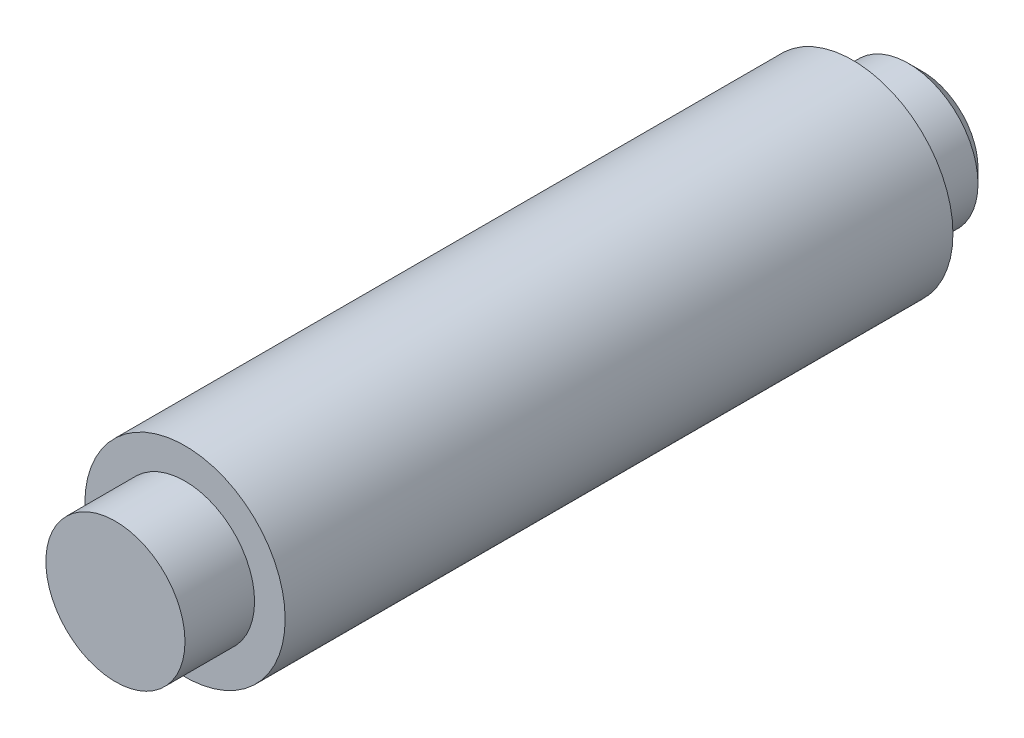
ISO-10303-21;
HEADER;
FILE_DESCRIPTION(('STEP AP214'),'2;1');
FILE_NAME('part.step','',(''),(''),'','','');
FILE_SCHEMA(('AUTOMOTIVE_DESIGN { 1 0 10303 214 1 1 1 1 }'));
ENDSEC;
DATA;
#1=APPLICATION_CONTEXT('core data for automotive mechanical design processes');
#2=APPLICATION_PROTOCOL_DEFINITION('international standard','automotive_design',2000,#1);
#3=PRODUCT_CONTEXT('',#1,'mechanical');
#4=PRODUCT('Part','Part','',(#3));
#5=PRODUCT_RELATED_PRODUCT_CATEGORY('part','',(#4));
#6=PRODUCT_DEFINITION_FORMATION('','',#4);
#7=PRODUCT_DEFINITION_CONTEXT('part definition',#1,'design');
#8=PRODUCT_DEFINITION('design','',#6,#7);
#9=PRODUCT_DEFINITION_SHAPE('','',#8);
#10=(LENGTH_UNIT() NAMED_UNIT(*) SI_UNIT(.MILLI.,.METRE.));
#11=(NAMED_UNIT(*) PLANE_ANGLE_UNIT() SI_UNIT($,.RADIAN.));
#12=(NAMED_UNIT(*) SI_UNIT($,.STERADIAN.) SOLID_ANGLE_UNIT());
#13=UNCERTAINTY_MEASURE_WITH_UNIT(LENGTH_MEASURE(1.E-05),#10,'distance_accuracy_value','');
#14=(GEOMETRIC_REPRESENTATION_CONTEXT(3) GLOBAL_UNCERTAINTY_ASSIGNED_CONTEXT((#13)) GLOBAL_UNIT_ASSIGNED_CONTEXT((#10,
#11,#12)) REPRESENTATION_CONTEXT('',''));
#15=CARTESIAN_POINT('',(0.,0.,0.));
#16=DIRECTION('',(0.,0.,1.));
#17=DIRECTION('',(1.,0.,0.));
#18=AXIS2_PLACEMENT_3D('',#15,#16,#17);
#19=CARTESIAN_POINT('',(0.,0.,24.));
#20=DIRECTION('',(0.,0.,-1.));
#21=DIRECTION('',(-1.,0.,0.));
#22=AXIS2_PLACEMENT_3D('',#19,#20,#21);
#23=CYLINDRICAL_SURFACE('',#22,3.6);
#24=CARTESIAN_POINT('',(0.,0.,24.));
#25=DIRECTION('',(0.,0.,1.));
#26=DIRECTION('',(1.,0.,0.));
#27=AXIS2_PLACEMENT_3D('',#24,#25,#26);
#28=CIRCLE('',#27,3.6);
#29=CARTESIAN_POINT('',(3.6,0.,24.));
#30=VERTEX_POINT('',#29);
#31=EDGE_CURVE('E49',#30,#30,#28,.T.);
#32=ORIENTED_EDGE('',*,*,#31,.F.);
#33=EDGE_LOOP('',(#32));
#34=FACE_BOUND('',#33,.T.);
#35=CARTESIAN_POINT('',(0.,0.,0.));
#36=DIRECTION('',(0.,0.,1.));
#37=DIRECTION('',(1.,0.,0.));
#38=AXIS2_PLACEMENT_3D('',#35,#36,#37);
#39=CIRCLE('',#38,3.6);
#40=CARTESIAN_POINT('',(3.6,0.,0.));
#41=VERTEX_POINT('',#40);
#42=EDGE_CURVE('E52',#41,#41,#39,.T.);
#43=ORIENTED_EDGE('',*,*,#42,.T.);
#44=EDGE_LOOP('',(#43));
#45=FACE_BOUND('',#44,.T.);
#46=ADVANCED_FACE('F33',(#34,#45),#23,.T.);
#47=CARTESIAN_POINT('',(0.,0.,24.));
#48=DIRECTION('',(0.,0.,1.));
#49=DIRECTION('',(1.,0.,0.));
#50=AXIS2_PLACEMENT_3D('',#47,#48,#49);
#51=PLANE('',#50);
#52=CARTESIAN_POINT('',(0.,0.,24.));
#53=DIRECTION('',(0.,0.,1.));
#54=DIRECTION('',(1.,0.,0.));
#55=AXIS2_PLACEMENT_3D('',#52,#53,#54);
#56=CIRCLE('',#55,2.5);
#57=CARTESIAN_POINT('',(2.5,0.,24.));
#58=VERTEX_POINT('',#57);
#59=EDGE_CURVE('E45',#58,#58,#56,.T.);
#60=ORIENTED_EDGE('',*,*,#59,.F.);
#61=EDGE_LOOP('',(#60));
#62=FACE_BOUND('',#61,.T.);
#63=ORIENTED_EDGE('',*,*,#31,.T.);
#64=EDGE_LOOP('',(#63));
#65=FACE_BOUND('',#64,.T.);
#66=ADVANCED_FACE('F73',(#62,#65),#51,.T.);
#67=CARTESIAN_POINT('',(0.,0.,0.));
#68=DIRECTION('',(0.,0.,1.));
#69=DIRECTION('',(1.,0.,0.));
#70=AXIS2_PLACEMENT_3D('',#67,#68,#69);
#71=PLANE('',#70);
#72=CARTESIAN_POINT('',(0.,0.,0.));
#73=DIRECTION('',(0.,0.,1.));
#74=DIRECTION('',(1.,0.,0.));
#75=AXIS2_PLACEMENT_3D('',#72,#73,#74);
#76=CIRCLE('',#75,2.5);
#77=CARTESIAN_POINT('',(2.5,0.,0.));
#78=VERTEX_POINT('',#77);
#79=EDGE_CURVE('E55',#78,#78,#76,.T.);
#80=ORIENTED_EDGE('',*,*,#79,.T.);
#81=EDGE_LOOP('',(#80));
#82=FACE_BOUND('',#81,.T.);
#83=ORIENTED_EDGE('',*,*,#42,.F.);
#84=EDGE_LOOP('',(#83));
#85=FACE_BOUND('',#84,.T.);
#86=ADVANCED_FACE('F76',(#82,#85),#71,.F.);
#87=CARTESIAN_POINT('',(0.,0.,-2.5));
#88=DIRECTION('',(0.,0.,1.));
#89=DIRECTION('',(1.,0.,0.));
#90=AXIS2_PLACEMENT_3D('',#87,#88,#89);
#91=CYLINDRICAL_SURFACE('',#90,2.5);
#92=CARTESIAN_POINT('',(0.,0.,-2.));
#93=DIRECTION('',(0.,0.,1.));
#94=DIRECTION('',(1.,0.,0.));
#95=AXIS2_PLACEMENT_3D('',#92,#93,#94);
#96=CIRCLE('',#95,2.5);
#97=CARTESIAN_POINT('',(2.5,0.,-2.));
#98=VERTEX_POINT('',#97);
#99=EDGE_CURVE('E41',#98,#98,#96,.T.);
#100=ORIENTED_EDGE('',*,*,#99,.T.);
#101=EDGE_LOOP('',(#100));
#102=FACE_BOUND('',#101,.T.);
#103=ORIENTED_EDGE('',*,*,#79,.F.);
#104=EDGE_LOOP('',(#103));
#105=FACE_BOUND('',#104,.T.);
#106=ADVANCED_FACE('F85',(#102,#105),#91,.T.);
#107=CARTESIAN_POINT('',(0.,0.,-2.5));
#108=DIRECTION('',(0.,0.,1.));
#109=DIRECTION('',(1.,0.,0.));
#110=AXIS2_PLACEMENT_3D('',#107,#108,#109);
#111=PLANE('',#110);
#112=CARTESIAN_POINT('',(0.,0.,-2.5));
#113=DIRECTION('',(0.,0.,1.));
#114=DIRECTION('',(1.,0.,0.));
#115=AXIS2_PLACEMENT_3D('',#112,#113,#114);
#116=CIRCLE('',#115,2.);
#117=CARTESIAN_POINT('',(2.,0.,-2.5));
#118=VERTEX_POINT('',#117);
#119=EDGE_CURVE('E10',#118,#118,#116,.F.);
#120=ORIENTED_EDGE('',*,*,#119,.T.);
#121=EDGE_LOOP('',(#120));
#122=FACE_BOUND('',#121,.T.);
#123=ADVANCED_FACE('F69',(#122),#111,.F.);
#124=CARTESIAN_POINT('',(0.,0.,26.5));
#125=DIRECTION('',(0.,0.,-1.));
#126=DIRECTION('',(-1.,0.,0.));
#127=AXIS2_PLACEMENT_3D('',#124,#125,#126);
#128=CYLINDRICAL_SURFACE('',#127,2.5);
#129=CARTESIAN_POINT('',(0.,0.,26.5));
#130=DIRECTION('',(0.,0.,1.));
#131=DIRECTION('',(1.,0.,0.));
#132=AXIS2_PLACEMENT_3D('',#129,#130,#131);
#133=CIRCLE('',#132,2.5);
#134=CARTESIAN_POINT('',(2.5,0.,26.5));
#135=VERTEX_POINT('',#134);
#136=EDGE_CURVE('E59',#135,#135,#133,.T.);
#137=ORIENTED_EDGE('',*,*,#136,.F.);
#138=EDGE_LOOP('',(#137));
#139=FACE_BOUND('',#138,.T.);
#140=ORIENTED_EDGE('',*,*,#59,.T.);
#141=EDGE_LOOP('',(#140));
#142=FACE_BOUND('',#141,.T.);
#143=ADVANCED_FACE('F66',(#139,#142),#128,.T.);
#144=CARTESIAN_POINT('',(0.,0.,26.5));
#145=DIRECTION('',(0.,0.,1.));
#146=DIRECTION('',(1.,0.,0.));
#147=AXIS2_PLACEMENT_3D('',#144,#145,#146);
#148=PLANE('',#147);
#149=ORIENTED_EDGE('',*,*,#136,.T.);
#150=EDGE_LOOP('',(#149));
#151=FACE_BOUND('',#150,.T.);
#152=ADVANCED_FACE('F64',(#151),#148,.T.);
#153=CARTESIAN_POINT('',(0.,0.,-2.));
#154=DIRECTION('',(0.,0.,1.));
#155=DIRECTION('',(1.,0.,0.));
#156=AXIS2_PLACEMENT_3D('',#153,#154,#155);
#157=CONICAL_SURFACE('',#156,2.5,0.78539816339745);
#158=ORIENTED_EDGE('',*,*,#119,.F.);
#159=EDGE_LOOP('',(#158));
#160=FACE_BOUND('',#159,.T.);
#161=ORIENTED_EDGE('',*,*,#99,.F.);
#162=EDGE_LOOP('',(#161));
#163=FACE_BOUND('',#162,.T.);
#164=ADVANCED_FACE('F36',(#160,#163),#157,.T.);
#165=CLOSED_SHELL('',(#46,#66,#86,#106,#123,#143,#152,#164));
#166=MANIFOLD_SOLID_BREP('B2',#165);
#167=ADVANCED_BREP_SHAPE_REPRESENTATION('',(#18,#166),#14);
#168=SHAPE_DEFINITION_REPRESENTATION(#9,#167);
ENDSEC;
END-ISO-10303-21;
